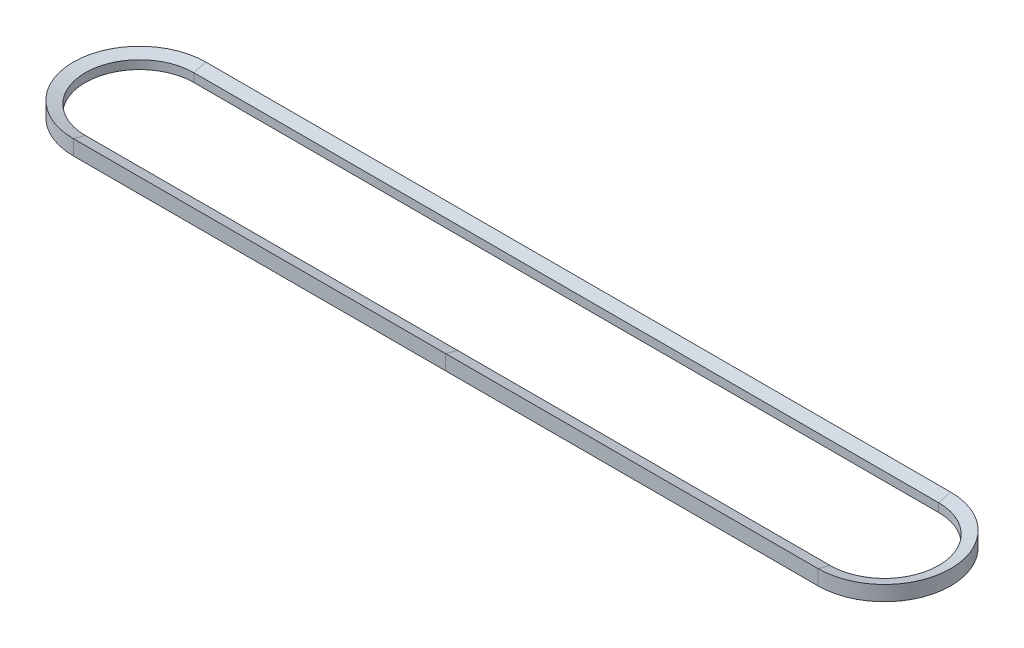
ISO-10303-21;
HEADER;
FILE_DESCRIPTION(('STEP AP214'),'2;1');
FILE_NAME('part.step','',(''),(''),'','','');
FILE_SCHEMA(('AUTOMOTIVE_DESIGN { 1 0 10303 214 1 1 1 1 }'));
ENDSEC;
DATA;
#1=APPLICATION_CONTEXT('core data for automotive mechanical design processes');
#2=APPLICATION_PROTOCOL_DEFINITION('international standard','automotive_design',2000,#1);
#3=PRODUCT_CONTEXT('',#1,'mechanical');
#4=PRODUCT('Part','Part','',(#3));
#5=PRODUCT_RELATED_PRODUCT_CATEGORY('part','',(#4));
#6=PRODUCT_DEFINITION_FORMATION('','',#4);
#7=PRODUCT_DEFINITION_CONTEXT('part definition',#1,'design');
#8=PRODUCT_DEFINITION('design','',#6,#7);
#9=PRODUCT_DEFINITION_SHAPE('','',#8);
#10=(LENGTH_UNIT() NAMED_UNIT(*) SI_UNIT(.MILLI.,.METRE.));
#11=(NAMED_UNIT(*) PLANE_ANGLE_UNIT() SI_UNIT($,.RADIAN.));
#12=(NAMED_UNIT(*) SI_UNIT($,.STERADIAN.) SOLID_ANGLE_UNIT());
#13=UNCERTAINTY_MEASURE_WITH_UNIT(LENGTH_MEASURE(1.E-05),#10,'distance_accuracy_value','');
#14=(GEOMETRIC_REPRESENTATION_CONTEXT(3) GLOBAL_UNCERTAINTY_ASSIGNED_CONTEXT((#13)) GLOBAL_UNIT_ASSIGNED_CONTEXT((#10,
#11,#12)) REPRESENTATION_CONTEXT('',''));
#15=CARTESIAN_POINT('',(0.,0.,0.));
#16=DIRECTION('',(0.,0.,1.));
#17=DIRECTION('',(1.,0.,0.));
#18=AXIS2_PLACEMENT_3D('',#15,#16,#17);
#19=CARTESIAN_POINT('',(217.695,2.5,31.7499999999999));
#20=DIRECTION('',(0.,0.,1.));
#21=DIRECTION('',(1.,0.,0.));
#22=AXIS2_PLACEMENT_3D('',#19,#20,#21);
#23=PLANE('',#22);
#24=DIRECTION('',(0.,1.,0.));
#25=VECTOR('',#24,1.);
#26=CARTESIAN_POINT('',(217.695,2.5,31.7499999999999));
#27=LINE('',#26,#25);
#28=CARTESIAN_POINT('',(217.695,-2.5,31.7499999999999));
#29=VERTEX_POINT('',#28);
#30=CARTESIAN_POINT('',(217.695,2.5,31.7499999999999));
#31=VERTEX_POINT('',#30);
#32=EDGE_CURVE('E168',#29,#31,#27,.T.);
#33=ORIENTED_EDGE('',*,*,#32,.F.);
#34=DIRECTION('',(-1.,0.,0.));
#35=VECTOR('',#34,1.);
#36=CARTESIAN_POINT('',(217.695,-2.5,31.7499999999999));
#37=LINE('',#36,#35);
#38=CARTESIAN_POINT('',(0.,-2.5,31.75));
#39=VERTEX_POINT('',#38);
#40=EDGE_CURVE('E167',#29,#39,#37,.T.);
#41=ORIENTED_EDGE('',*,*,#40,.T.);
#42=DIRECTION('',(0.,1.,0.));
#43=VECTOR('',#42,1.);
#44=CARTESIAN_POINT('',(0.,2.5,31.75));
#45=LINE('',#44,#43);
#46=CARTESIAN_POINT('',(0.,2.5,31.75));
#47=VERTEX_POINT('',#46);
#48=EDGE_CURVE('E142',#39,#47,#45,.T.);
#49=ORIENTED_EDGE('',*,*,#48,.T.);
#50=DIRECTION('',(-1.,0.,0.));
#51=VECTOR('',#50,1.);
#52=CARTESIAN_POINT('',(217.695,2.5,31.7499999999999));
#53=LINE('',#52,#51);
#54=EDGE_CURVE('E172',#31,#47,#53,.T.);
#55=ORIENTED_EDGE('',*,*,#54,.F.);
#56=EDGE_LOOP('',(#33,#41,#49,#55));
#57=FACE_BOUND('',#56,.T.);
#58=ADVANCED_FACE('F34',(#57),#23,.F.);
#59=CARTESIAN_POINT('',(0.,2.5,31.75));
#60=DIRECTION('',(0.,0.,1.));
#61=DIRECTION('',(1.,0.,0.));
#62=AXIS2_PLACEMENT_3D('',#59,#60,#61);
#63=PLANE('',#62);
#64=DIRECTION('',(-1.,0.,0.));
#65=VECTOR('',#64,1.);
#66=CARTESIAN_POINT('',(0.,2.5,31.75));
#67=LINE('',#66,#65);
#68=CARTESIAN_POINT('',(-217.695,2.5,31.75));
#69=VERTEX_POINT('',#68);
#70=EDGE_CURVE('E148',#47,#69,#67,.T.);
#71=ORIENTED_EDGE('',*,*,#70,.F.);
#72=ORIENTED_EDGE('',*,*,#48,.F.);
#73=DIRECTION('',(-1.,0.,0.));
#74=VECTOR('',#73,1.);
#75=CARTESIAN_POINT('',(0.,-2.5,31.75));
#76=LINE('',#75,#74);
#77=CARTESIAN_POINT('',(-217.695,-2.5,31.75));
#78=VERTEX_POINT('',#77);
#79=EDGE_CURVE('E146',#39,#78,#76,.T.);
#80=ORIENTED_EDGE('',*,*,#79,.T.);
#81=DIRECTION('',(0.,1.,0.));
#82=VECTOR('',#81,1.);
#83=CARTESIAN_POINT('',(-217.695,2.5,31.75));
#84=LINE('',#83,#82);
#85=EDGE_CURVE('E164',#78,#69,#84,.T.);
#86=ORIENTED_EDGE('',*,*,#85,.T.);
#87=EDGE_LOOP('',(#71,#72,#80,#86));
#88=FACE_BOUND('',#87,.T.);
#89=ADVANCED_FACE('F144',(#88),#63,.F.);
#90=CARTESIAN_POINT('',(0.,4.37564434701781,38.75));
#91=DIRECTION('',(0.,-0.96592582628907,0.258819045102514));
#92=DIRECTION('',(0.,-0.258819045102514,-0.96592582628907));
#93=AXIS2_PLACEMENT_3D('',#90,#91,#92);
#94=PLANE('',#93);
#95=DIRECTION('',(-1.,0.,0.));
#96=VECTOR('',#95,1.);
#97=CARTESIAN_POINT('',(0.,4.37564434701781,38.75));
#98=LINE('',#97,#96);
#99=CARTESIAN_POINT('',(0.,4.37564434701781,38.75));
#100=VERTEX_POINT('',#99);
#101=CARTESIAN_POINT('',(-217.695,4.37564434701781,38.75));
#102=VERTEX_POINT('',#101);
#103=EDGE_CURVE('E213',#100,#102,#98,.T.);
#104=ORIENTED_EDGE('',*,*,#103,.F.);
#105=DIRECTION('',(0.,0.258819045102514,0.96592582628907));
#106=VECTOR('',#105,1.);
#107=CARTESIAN_POINT('',(0.,4.37564434701781,38.75));
#108=LINE('',#107,#106);
#109=EDGE_CURVE('E153',#47,#100,#108,.T.);
#110=ORIENTED_EDGE('',*,*,#109,.F.);
#111=ORIENTED_EDGE('',*,*,#70,.T.);
#112=DIRECTION('',(0.,0.258819045102514,0.96592582628907));
#113=VECTOR('',#112,1.);
#114=CARTESIAN_POINT('',(-217.695,4.37564434701781,38.75));
#115=LINE('',#114,#113);
#116=EDGE_CURVE('E238',#69,#102,#115,.T.);
#117=ORIENTED_EDGE('',*,*,#116,.T.);
#118=EDGE_LOOP('',(#104,#110,#111,#117));
#119=FACE_BOUND('',#118,.T.);
#120=ADVANCED_FACE('F258',(#119),#94,.F.);
#121=CARTESIAN_POINT('',(0.,-4.37564434701787,38.75));
#122=DIRECTION('',(0.,0.,-1.));
#123=DIRECTION('',(-1.,0.,0.));
#124=AXIS2_PLACEMENT_3D('',#121,#122,#123);
#125=PLANE('',#124);
#126=DIRECTION('',(-1.,0.,0.));
#127=VECTOR('',#126,1.);
#128=CARTESIAN_POINT('',(0.,-4.37564434701787,38.75));
#129=LINE('',#128,#127);
#130=CARTESIAN_POINT('',(0.,-4.37564434701787,38.75));
#131=VERTEX_POINT('',#130);
#132=CARTESIAN_POINT('',(-217.695,-4.37564434701787,38.75));
#133=VERTEX_POINT('',#132);
#134=EDGE_CURVE('E183',#131,#133,#129,.T.);
#135=ORIENTED_EDGE('',*,*,#134,.F.);
#136=DIRECTION('',(0.,-1.,0.));
#137=VECTOR('',#136,1.);
#138=CARTESIAN_POINT('',(0.,-4.37564434701787,38.75));
#139=LINE('',#138,#137);
#140=EDGE_CURVE('E175',#100,#131,#139,.T.);
#141=ORIENTED_EDGE('',*,*,#140,.F.);
#142=ORIENTED_EDGE('',*,*,#103,.T.);
#143=DIRECTION('',(0.,-1.,0.));
#144=VECTOR('',#143,1.);
#145=CARTESIAN_POINT('',(-217.695,-4.37564434701787,38.75));
#146=LINE('',#145,#144);
#147=EDGE_CURVE('E215',#102,#133,#146,.T.);
#148=ORIENTED_EDGE('',*,*,#147,.T.);
#149=EDGE_LOOP('',(#135,#141,#142,#148));
#150=FACE_BOUND('',#149,.T.);
#151=ADVANCED_FACE('F211',(#150),#125,.F.);
#152=CARTESIAN_POINT('',(0.,-2.5,31.75));
#153=DIRECTION('',(0.,0.965925826289068,0.258819045102522));
#154=DIRECTION('',(0.,-0.258819045102522,0.965925826289068));
#155=AXIS2_PLACEMENT_3D('',#152,#153,#154);
#156=PLANE('',#155);
#157=DIRECTION('',(0.,0.258819045102522,-0.965925826289068));
#158=VECTOR('',#157,1.);
#159=CARTESIAN_POINT('',(-217.695,-2.5,31.75));
#160=LINE('',#159,#158);
#161=EDGE_CURVE('E162',#133,#78,#160,.T.);
#162=ORIENTED_EDGE('',*,*,#161,.T.);
#163=ORIENTED_EDGE('',*,*,#79,.F.);
#164=DIRECTION('',(0.,0.258819045102522,-0.965925826289068));
#165=VECTOR('',#164,1.);
#166=CARTESIAN_POINT('',(0.,-2.5,31.75));
#167=LINE('',#166,#165);
#168=EDGE_CURVE('E160',#131,#39,#167,.T.);
#169=ORIENTED_EDGE('',*,*,#168,.F.);
#170=ORIENTED_EDGE('',*,*,#134,.T.);
#171=EDGE_LOOP('',(#162,#163,#169,#170));
#172=FACE_BOUND('',#171,.T.);
#173=ADVANCED_FACE('F158',(#172),#156,.F.);
#174=CARTESIAN_POINT('',(-217.695,0.,0.));
#175=DIRECTION('',(0.,-1.,0.));
#176=DIRECTION('',(0.,0.,-1.));
#177=AXIS2_PLACEMENT_3D('',#174,#175,#176);
#178=CYLINDRICAL_SURFACE('',#177,31.75);
#179=CARTESIAN_POINT('',(-217.695,2.5,0.));
#180=DIRECTION('',(0.,-1.,0.));
#181=DIRECTION('',(0.,0.,1.));
#182=AXIS2_PLACEMENT_3D('',#179,#180,#181);
#183=CIRCLE('',#182,31.75);
#184=CARTESIAN_POINT('',(-217.695,2.5,-31.75));
#185=VERTEX_POINT('',#184);
#186=EDGE_CURVE('E127',#69,#185,#183,.T.);
#187=ORIENTED_EDGE('',*,*,#186,.F.);
#188=ORIENTED_EDGE('',*,*,#85,.F.);
#189=CARTESIAN_POINT('',(-217.695,-2.5,0.));
#190=DIRECTION('',(0.,-1.,0.));
#191=DIRECTION('',(0.,0.,1.));
#192=AXIS2_PLACEMENT_3D('',#189,#190,#191);
#193=CIRCLE('',#192,31.75);
#194=CARTESIAN_POINT('',(-217.695,-2.5,-31.75));
#195=VERTEX_POINT('',#194);
#196=EDGE_CURVE('E182',#78,#195,#193,.T.);
#197=ORIENTED_EDGE('',*,*,#196,.T.);
#198=DIRECTION('',(0.,1.,0.));
#199=VECTOR('',#198,1.);
#200=CARTESIAN_POINT('',(-217.695,2.5,-31.75));
#201=LINE('',#200,#199);
#202=EDGE_CURVE('E243',#195,#185,#201,.T.);
#203=ORIENTED_EDGE('',*,*,#202,.T.);
#204=EDGE_LOOP('',(#187,#188,#197,#203));
#205=FACE_BOUND('',#204,.T.);
#206=ADVANCED_FACE('F283',(#205),#178,.F.);
#207=CARTESIAN_POINT('',(-217.695,2.5,0.));
#208=DIRECTION('',(0.,1.,0.));
#209=DIRECTION('',(0.,0.,1.));
#210=AXIS2_PLACEMENT_3D('',#207,#208,#209);
#211=CONICAL_SURFACE('',#210,31.75,1.30899693899575);
#212=CARTESIAN_POINT('',(-217.695,4.37564434701781,0.));
#213=DIRECTION('',(0.,-1.,0.));
#214=DIRECTION('',(0.,0.,1.));
#215=AXIS2_PLACEMENT_3D('',#212,#213,#214);
#216=CIRCLE('',#215,38.75);
#217=CARTESIAN_POINT('',(-217.695,4.37564434701781,-38.75));
#218=VERTEX_POINT('',#217);
#219=EDGE_CURVE('E121',#102,#218,#216,.T.);
#220=ORIENTED_EDGE('',*,*,#219,.F.);
#221=ORIENTED_EDGE('',*,*,#116,.F.);
#222=ORIENTED_EDGE('',*,*,#186,.T.);
#223=DIRECTION('',(0.,0.258819045102514,-0.96592582628907));
#224=VECTOR('',#223,1.);
#225=CARTESIAN_POINT('',(-217.695,4.37564434701781,-38.75));
#226=LINE('',#225,#224);
#227=EDGE_CURVE('E220',#185,#218,#226,.T.);
#228=ORIENTED_EDGE('',*,*,#227,.T.);
#229=EDGE_LOOP('',(#220,#221,#222,#228));
#230=FACE_BOUND('',#229,.T.);
#231=ADVANCED_FACE('F285',(#230),#211,.F.);
#232=CARTESIAN_POINT('',(-217.695,0.,0.));
#233=DIRECTION('',(0.,-1.,0.));
#234=DIRECTION('',(0.,0.,-1.));
#235=AXIS2_PLACEMENT_3D('',#232,#233,#234);
#236=CYLINDRICAL_SURFACE('',#235,38.75);
#237=CARTESIAN_POINT('',(-217.695,-4.37564434701787,0.));
#238=DIRECTION('',(0.,-1.,0.));
#239=DIRECTION('',(0.,0.,1.));
#240=AXIS2_PLACEMENT_3D('',#237,#238,#239);
#241=CIRCLE('',#240,38.75);
#242=CARTESIAN_POINT('',(-217.695,-4.37564434701787,-38.75));
#243=VERTEX_POINT('',#242);
#244=EDGE_CURVE('E187',#133,#243,#241,.T.);
#245=ORIENTED_EDGE('',*,*,#244,.F.);
#246=ORIENTED_EDGE('',*,*,#147,.F.);
#247=ORIENTED_EDGE('',*,*,#219,.T.);
#248=DIRECTION('',(0.,-1.,0.));
#249=VECTOR('',#248,1.);
#250=CARTESIAN_POINT('',(-217.695,-4.37564434701787,-38.75));
#251=LINE('',#250,#249);
#252=EDGE_CURVE('E219',#218,#243,#251,.T.);
#253=ORIENTED_EDGE('',*,*,#252,.T.);
#254=EDGE_LOOP('',(#245,#246,#247,#253));
#255=FACE_BOUND('',#254,.T.);
#256=ADVANCED_FACE('F291',(#255),#236,.T.);
#257=CARTESIAN_POINT('',(-217.695,-4.37564434701787,0.));
#258=DIRECTION('',(0.,-1.,0.));
#259=DIRECTION('',(0.,0.,-1.));
#260=AXIS2_PLACEMENT_3D('',#257,#258,#259);
#261=CONICAL_SURFACE('',#260,38.75,1.30899693899575);
#262=DIRECTION('',(0.,0.258819045102522,0.965925826289068));
#263=VECTOR('',#262,1.);
#264=CARTESIAN_POINT('',(-217.695,-2.5,-31.75));
#265=LINE('',#264,#263);
#266=EDGE_CURVE('E184',#243,#195,#265,.T.);
#267=ORIENTED_EDGE('',*,*,#266,.T.);
#268=ORIENTED_EDGE('',*,*,#196,.F.);
#269=ORIENTED_EDGE('',*,*,#161,.F.);
#270=ORIENTED_EDGE('',*,*,#244,.T.);
#271=EDGE_LOOP('',(#267,#268,#269,#270));
#272=FACE_BOUND('',#271,.T.);
#273=ADVANCED_FACE('F281',(#272),#261,.F.);
#274=CARTESIAN_POINT('',(-217.695,2.5,-31.75));
#275=DIRECTION('',(0.,0.,-1.));
#276=DIRECTION('',(-1.,0.,0.));
#277=AXIS2_PLACEMENT_3D('',#274,#275,#276);
#278=PLANE('',#277);
#279=DIRECTION('',(1.,0.,0.));
#280=VECTOR('',#279,1.);
#281=CARTESIAN_POINT('',(-217.695,2.5,-31.75));
#282=LINE('',#281,#280);
#283=CARTESIAN_POINT('',(217.694999999999,2.5,-31.7500000000001));
#284=VERTEX_POINT('',#283);
#285=EDGE_CURVE('E104',#185,#284,#282,.T.);
#286=ORIENTED_EDGE('',*,*,#285,.F.);
#287=ORIENTED_EDGE('',*,*,#202,.F.);
#288=DIRECTION('',(1.,0.,0.));
#289=VECTOR('',#288,1.);
#290=CARTESIAN_POINT('',(-217.695,-2.5,-31.75));
#291=LINE('',#290,#289);
#292=CARTESIAN_POINT('',(217.694999999999,-2.5,-31.7500000000001));
#293=VERTEX_POINT('',#292);
#294=EDGE_CURVE('E186',#195,#293,#291,.T.);
#295=ORIENTED_EDGE('',*,*,#294,.T.);
#296=DIRECTION('',(0.,1.,0.));
#297=VECTOR('',#296,1.);
#298=CARTESIAN_POINT('',(217.695,2.5,-31.7500000000001));
#299=LINE('',#298,#297);
#300=EDGE_CURVE('E196',#293,#284,#299,.T.);
#301=ORIENTED_EDGE('',*,*,#300,.T.);
#302=EDGE_LOOP('',(#286,#287,#295,#301));
#303=FACE_BOUND('',#302,.T.);
#304=ADVANCED_FACE('F277',(#303),#278,.F.);
#305=CARTESIAN_POINT('',(-217.695,4.37564434701781,-38.75));
#306=DIRECTION('',(0.,-0.96592582628907,-0.258819045102514));
#307=DIRECTION('',(0.,0.258819045102514,-0.96592582628907));
#308=AXIS2_PLACEMENT_3D('',#305,#306,#307);
#309=PLANE('',#308);
#310=DIRECTION('',(1.,0.,0.));
#311=VECTOR('',#310,1.);
#312=CARTESIAN_POINT('',(-217.695,4.37564434701781,-38.75));
#313=LINE('',#312,#311);
#314=CARTESIAN_POINT('',(217.694999999999,4.37564434701781,-38.7500000000001));
#315=VERTEX_POINT('',#314);
#316=EDGE_CURVE('E97',#218,#315,#313,.T.);
#317=ORIENTED_EDGE('',*,*,#316,.F.);
#318=ORIENTED_EDGE('',*,*,#227,.F.);
#319=ORIENTED_EDGE('',*,*,#285,.T.);
#320=DIRECTION('',(0.,0.258819045102514,-0.96592582628907));
#321=VECTOR('',#320,1.);
#322=CARTESIAN_POINT('',(217.695,4.37564434701781,-38.7500000000001));
#323=LINE('',#322,#321);
#324=EDGE_CURVE('E194',#284,#315,#323,.T.);
#325=ORIENTED_EDGE('',*,*,#324,.T.);
#326=EDGE_LOOP('',(#317,#318,#319,#325));
#327=FACE_BOUND('',#326,.T.);
#328=ADVANCED_FACE('F280',(#327),#309,.F.);
#329=CARTESIAN_POINT('',(-217.695,-4.37564434701787,-38.75));
#330=DIRECTION('',(0.,0.,1.));
#331=DIRECTION('',(1.,0.,0.));
#332=AXIS2_PLACEMENT_3D('',#329,#330,#331);
#333=PLANE('',#332);
#334=DIRECTION('',(1.,0.,0.));
#335=VECTOR('',#334,1.);
#336=CARTESIAN_POINT('',(-217.695,-4.37564434701787,-38.75));
#337=LINE('',#336,#335);
#338=CARTESIAN_POINT('',(217.694999999999,-4.37564434701787,-38.7500000000001));
#339=VERTEX_POINT('',#338);
#340=EDGE_CURVE('E88',#243,#339,#337,.T.);
#341=ORIENTED_EDGE('',*,*,#340,.F.);
#342=ORIENTED_EDGE('',*,*,#252,.F.);
#343=ORIENTED_EDGE('',*,*,#316,.T.);
#344=DIRECTION('',(0.,-1.,0.));
#345=VECTOR('',#344,1.);
#346=CARTESIAN_POINT('',(217.695,-4.37564434701787,-38.7500000000001));
#347=LINE('',#346,#345);
#348=EDGE_CURVE('E190',#315,#339,#347,.T.);
#349=ORIENTED_EDGE('',*,*,#348,.T.);
#350=EDGE_LOOP('',(#341,#342,#343,#349));
#351=FACE_BOUND('',#350,.T.);
#352=ADVANCED_FACE('F295',(#351),#333,.F.);
#353=CARTESIAN_POINT('',(-217.695,-2.5,-31.75));
#354=DIRECTION('',(0.,0.965925826289068,-0.258819045102522));
#355=DIRECTION('',(0.,0.258819045102522,0.965925826289068));
#356=AXIS2_PLACEMENT_3D('',#353,#354,#355);
#357=PLANE('',#356);
#358=DIRECTION('',(0.,0.258819045102522,0.965925826289068));
#359=VECTOR('',#358,1.);
#360=CARTESIAN_POINT('',(217.695,-2.5,-31.7500000000001));
#361=LINE('',#360,#359);
#362=EDGE_CURVE('E188',#339,#293,#361,.T.);
#363=ORIENTED_EDGE('',*,*,#362,.T.);
#364=ORIENTED_EDGE('',*,*,#294,.F.);
#365=ORIENTED_EDGE('',*,*,#266,.F.);
#366=ORIENTED_EDGE('',*,*,#340,.T.);
#367=EDGE_LOOP('',(#363,#364,#365,#366));
#368=FACE_BOUND('',#367,.T.);
#369=ADVANCED_FACE('F276',(#368),#357,.F.);
#370=CARTESIAN_POINT('',(217.695,0.,0.));
#371=DIRECTION('',(0.,-1.,0.));
#372=DIRECTION('',(0.,0.,-1.));
#373=AXIS2_PLACEMENT_3D('',#370,#371,#372);
#374=CYLINDRICAL_SURFACE('',#373,31.75);
#375=CARTESIAN_POINT('',(217.695,2.5,0.));
#376=DIRECTION('',(0.,-1.,0.));
#377=DIRECTION('',(0.,0.,-1.));
#378=AXIS2_PLACEMENT_3D('',#375,#376,#377);
#379=CIRCLE('',#378,31.75);
#380=EDGE_CURVE('E228',#284,#31,#379,.T.);
#381=ORIENTED_EDGE('',*,*,#380,.F.);
#382=ORIENTED_EDGE('',*,*,#300,.F.);
#383=CARTESIAN_POINT('',(217.695,-2.5,0.));
#384=DIRECTION('',(0.,-1.,0.));
#385=DIRECTION('',(0.,0.,-1.));
#386=AXIS2_PLACEMENT_3D('',#383,#384,#385);
#387=CIRCLE('',#386,31.75);
#388=EDGE_CURVE('E189',#293,#29,#387,.T.);
#389=ORIENTED_EDGE('',*,*,#388,.T.);
#390=ORIENTED_EDGE('',*,*,#32,.T.);
#391=EDGE_LOOP('',(#381,#382,#389,#390));
#392=FACE_BOUND('',#391,.T.);
#393=ADVANCED_FACE('F273',(#392),#374,.F.);
#394=CARTESIAN_POINT('',(217.695,2.5,0.));
#395=DIRECTION('',(0.,1.,0.));
#396=DIRECTION('',(0.,0.,1.));
#397=AXIS2_PLACEMENT_3D('',#394,#395,#396);
#398=CONICAL_SURFACE('',#397,31.75,1.30899693899575);
#399=CARTESIAN_POINT('',(217.695,4.37564434701781,0.));
#400=DIRECTION('',(0.,-1.,0.));
#401=DIRECTION('',(0.,0.,-1.));
#402=AXIS2_PLACEMENT_3D('',#399,#400,#401);
#403=CIRCLE('',#402,38.75);
#404=CARTESIAN_POINT('',(217.695,4.37564434701781,38.7499999999999));
#405=VERTEX_POINT('',#404);
#406=EDGE_CURVE('E59',#315,#405,#403,.T.);
#407=ORIENTED_EDGE('',*,*,#406,.F.);
#408=ORIENTED_EDGE('',*,*,#324,.F.);
#409=ORIENTED_EDGE('',*,*,#380,.T.);
#410=DIRECTION('',(0.,0.258819045102514,0.96592582628907));
#411=VECTOR('',#410,1.);
#412=CARTESIAN_POINT('',(217.695,4.37564434701781,38.7499999999999));
#413=LINE('',#412,#411);
#414=EDGE_CURVE('E226',#31,#405,#413,.T.);
#415=ORIENTED_EDGE('',*,*,#414,.T.);
#416=EDGE_LOOP('',(#407,#408,#409,#415));
#417=FACE_BOUND('',#416,.T.);
#418=ADVANCED_FACE('F254',(#417),#398,.F.);
#419=CARTESIAN_POINT('',(217.695,0.,0.));
#420=DIRECTION('',(0.,-1.,0.));
#421=DIRECTION('',(0.,0.,-1.));
#422=AXIS2_PLACEMENT_3D('',#419,#420,#421);
#423=CYLINDRICAL_SURFACE('',#422,38.75);
#424=CARTESIAN_POINT('',(217.695,-4.37564434701787,0.));
#425=DIRECTION('',(0.,-1.,0.));
#426=DIRECTION('',(0.,0.,-1.));
#427=AXIS2_PLACEMENT_3D('',#424,#425,#426);
#428=CIRCLE('',#427,38.75);
#429=CARTESIAN_POINT('',(217.695,-4.37564434701787,38.7499999999999));
#430=VERTEX_POINT('',#429);
#431=EDGE_CURVE('E51',#339,#430,#428,.T.);
#432=ORIENTED_EDGE('',*,*,#431,.F.);
#433=ORIENTED_EDGE('',*,*,#348,.F.);
#434=ORIENTED_EDGE('',*,*,#406,.T.);
#435=DIRECTION('',(0.,-1.,0.));
#436=VECTOR('',#435,1.);
#437=CARTESIAN_POINT('',(217.695,-4.37564434701787,38.7499999999999));
#438=LINE('',#437,#436);
#439=EDGE_CURVE('E202',#405,#430,#438,.T.);
#440=ORIENTED_EDGE('',*,*,#439,.T.);
#441=EDGE_LOOP('',(#432,#433,#434,#440));
#442=FACE_BOUND('',#441,.T.);
#443=ADVANCED_FACE('F304',(#442),#423,.T.);
#444=CARTESIAN_POINT('',(217.695,-4.37564434701787,0.));
#445=DIRECTION('',(0.,-1.,0.));
#446=DIRECTION('',(0.,0.,-1.));
#447=AXIS2_PLACEMENT_3D('',#444,#445,#446);
#448=CONICAL_SURFACE('',#447,38.75,1.30899693899575);
#449=DIRECTION('',(0.,0.258819045102522,-0.965925826289068));
#450=VECTOR('',#449,1.);
#451=CARTESIAN_POINT('',(217.695,-2.5,31.7499999999999));
#452=LINE('',#451,#450);
#453=EDGE_CURVE('E38',#430,#29,#452,.T.);
#454=ORIENTED_EDGE('',*,*,#453,.T.);
#455=ORIENTED_EDGE('',*,*,#388,.F.);
#456=ORIENTED_EDGE('',*,*,#362,.F.);
#457=ORIENTED_EDGE('',*,*,#431,.T.);
#458=EDGE_LOOP('',(#454,#455,#456,#457));
#459=FACE_BOUND('',#458,.T.);
#460=ADVANCED_FACE('F203',(#459),#448,.F.);
#461=CARTESIAN_POINT('',(217.695,4.37564434701781,38.7499999999999));
#462=DIRECTION('',(0.,-0.96592582628907,0.258819045102514));
#463=DIRECTION('',(0.,-0.258819045102514,-0.96592582628907));
#464=AXIS2_PLACEMENT_3D('',#461,#462,#463);
#465=PLANE('',#464);
#466=ORIENTED_EDGE('',*,*,#54,.T.);
#467=ORIENTED_EDGE('',*,*,#109,.T.);
#468=DIRECTION('',(-1.,0.,0.));
#469=VECTOR('',#468,1.);
#470=CARTESIAN_POINT('',(217.695,4.37564434701781,38.7499999999999));
#471=LINE('',#470,#469);
#472=EDGE_CURVE('E43',#405,#100,#471,.T.);
#473=ORIENTED_EDGE('',*,*,#472,.F.);
#474=ORIENTED_EDGE('',*,*,#414,.F.);
#475=EDGE_LOOP('',(#466,#467,#473,#474));
#476=FACE_BOUND('',#475,.T.);
#477=ADVANCED_FACE('F257',(#476),#465,.F.);
#478=CARTESIAN_POINT('',(217.695,-4.37564434701787,38.7499999999999));
#479=DIRECTION('',(0.,0.,-1.));
#480=DIRECTION('',(-1.,0.,0.));
#481=AXIS2_PLACEMENT_3D('',#478,#479,#480);
#482=PLANE('',#481);
#483=ORIENTED_EDGE('',*,*,#472,.T.);
#484=ORIENTED_EDGE('',*,*,#140,.T.);
#485=DIRECTION('',(-1.,0.,0.));
#486=VECTOR('',#485,1.);
#487=CARTESIAN_POINT('',(217.695,-4.37564434701787,38.7499999999999));
#488=LINE('',#487,#486);
#489=EDGE_CURVE('E11',#430,#131,#488,.T.);
#490=ORIENTED_EDGE('',*,*,#489,.F.);
#491=ORIENTED_EDGE('',*,*,#439,.F.);
#492=EDGE_LOOP('',(#483,#484,#490,#491));
#493=FACE_BOUND('',#492,.T.);
#494=ADVANCED_FACE('F207',(#493),#482,.F.);
#495=CARTESIAN_POINT('',(217.695,-2.5,31.7499999999999));
#496=DIRECTION('',(0.,0.965925826289068,0.258819045102522));
#497=DIRECTION('',(0.,-0.258819045102522,0.965925826289068));
#498=AXIS2_PLACEMENT_3D('',#495,#496,#497);
#499=PLANE('',#498);
#500=ORIENTED_EDGE('',*,*,#489,.T.);
#501=ORIENTED_EDGE('',*,*,#168,.T.);
#502=ORIENTED_EDGE('',*,*,#40,.F.);
#503=ORIENTED_EDGE('',*,*,#453,.F.);
#504=EDGE_LOOP('',(#500,#501,#502,#503));
#505=FACE_BOUND('',#504,.T.);
#506=ADVANCED_FACE('F36',(#505),#499,.F.);
#507=CLOSED_SHELL('',(#58,#89,#120,#151,#173,#206,#231,#256,#273,#304,#328,#352,#369,#393,#418,
#443,#460,#477,#494,#506));
#508=MANIFOLD_SOLID_BREP('B2',#507);
#509=ADVANCED_BREP_SHAPE_REPRESENTATION('',(#18,#508),#14);
#510=SHAPE_DEFINITION_REPRESENTATION(#9,#509);
ENDSEC;
END-ISO-10303-21;
